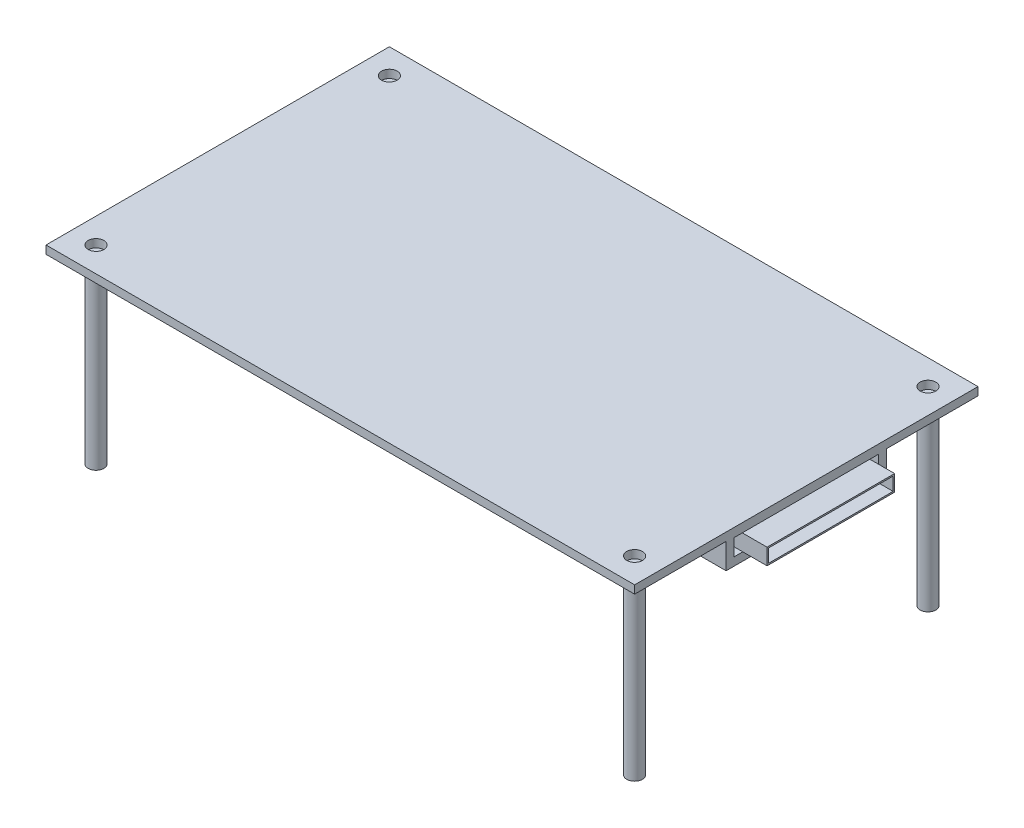
ISO-10303-21;
HEADER;
FILE_DESCRIPTION(('STEP AP214'),'2;1');
FILE_NAME('part.step','',(''),(''),'','','');
FILE_SCHEMA(('AUTOMOTIVE_DESIGN { 1 0 10303 214 1 1 1 1 }'));
ENDSEC;
DATA;
#1=APPLICATION_CONTEXT('core data for automotive mechanical design processes');
#2=APPLICATION_PROTOCOL_DEFINITION('international standard','automotive_design',2000,#1);
#3=PRODUCT_CONTEXT('',#1,'mechanical');
#4=PRODUCT('Part','Part','',(#3));
#5=PRODUCT_RELATED_PRODUCT_CATEGORY('part','',(#4));
#6=PRODUCT_DEFINITION_FORMATION('','',#4);
#7=PRODUCT_DEFINITION_CONTEXT('part definition',#1,'design');
#8=PRODUCT_DEFINITION('design','',#6,#7);
#9=PRODUCT_DEFINITION_SHAPE('','',#8);
#10=(LENGTH_UNIT() NAMED_UNIT(*) SI_UNIT(.MILLI.,.METRE.));
#11=(NAMED_UNIT(*) PLANE_ANGLE_UNIT() SI_UNIT($,.RADIAN.));
#12=(NAMED_UNIT(*) SI_UNIT($,.STERADIAN.) SOLID_ANGLE_UNIT());
#13=UNCERTAINTY_MEASURE_WITH_UNIT(LENGTH_MEASURE(1.E-05),#10,'distance_accuracy_value','');
#14=(GEOMETRIC_REPRESENTATION_CONTEXT(3) GLOBAL_UNCERTAINTY_ASSIGNED_CONTEXT((#13)) GLOBAL_UNIT_ASSIGNED_CONTEXT((#10,
#11,#12)) REPRESENTATION_CONTEXT('',''));
#15=CARTESIAN_POINT('',(0.,0.,0.));
#16=DIRECTION('',(0.,0.,1.));
#17=DIRECTION('',(1.,0.,0.));
#18=AXIS2_PLACEMENT_3D('',#15,#16,#17);
#19=CARTESIAN_POINT('',(-54.9,-35.15,29.9000000000008));
#20=DIRECTION('',(0.,1.,0.));
#21=DIRECTION('',(0.,0.,1.));
#22=AXIS2_PLACEMENT_3D('',#19,#20,#21);
#23=CYLINDRICAL_SURFACE('',#22,1.6);
#24=CARTESIAN_POINT('',(-54.9,-35.15,29.9000000000008));
#25=DIRECTION('',(0.,-1.,0.));
#26=DIRECTION('',(0.,0.,-1.));
#27=AXIS2_PLACEMENT_3D('',#24,#25,#26);
#28=CIRCLE('',#27,1.6);
#29=CARTESIAN_POINT('',(-54.9,-35.15,28.3000000000008));
#30=VERTEX_POINT('',#29);
#31=EDGE_CURVE('E11',#30,#30,#28,.T.);
#32=ORIENTED_EDGE('',*,*,#31,.F.);
#33=EDGE_LOOP('',(#32));
#34=FACE_BOUND('',#33,.T.);
#35=CARTESIAN_POINT('',(-54.9,1.85,29.9000000000008));
#36=DIRECTION('',(0.,-1.,0.));
#37=DIRECTION('',(0.,0.,-1.));
#38=AXIS2_PLACEMENT_3D('',#35,#36,#37);
#39=CIRCLE('',#38,1.6);
#40=CARTESIAN_POINT('',(-54.9,1.85,28.3000000000008));
#41=VERTEX_POINT('',#40);
#42=EDGE_CURVE('E47',#41,#41,#39,.T.);
#43=ORIENTED_EDGE('',*,*,#42,.T.);
#44=EDGE_LOOP('',(#43));
#45=FACE_BOUND('',#44,.T.);
#46=ADVANCED_FACE('F44',(#34,#45),#23,.T.);
#47=CARTESIAN_POINT('',(-54.9,-35.15,29.9000000000008));
#48=DIRECTION('',(0.,-1.,0.));
#49=DIRECTION('',(0.,0.,-1.));
#50=AXIS2_PLACEMENT_3D('',#47,#48,#49);
#51=PLANE('',#50);
#52=ORIENTED_EDGE('',*,*,#31,.T.);
#53=EDGE_LOOP('',(#52));
#54=FACE_BOUND('',#53,.T.);
#55=ADVANCED_FACE('F59',(#54),#51,.T.);
#56=CARTESIAN_POINT('',(-54.9,1.85,29.9000000000008));
#57=DIRECTION('',(0.,-1.,0.));
#58=DIRECTION('',(0.,0.,-1.));
#59=AXIS2_PLACEMENT_3D('',#56,#57,#58);
#60=PLANE('',#59);
#61=ORIENTED_EDGE('',*,*,#42,.F.);
#62=EDGE_LOOP('',(#61));
#63=FACE_BOUND('',#62,.T.);
#64=ADVANCED_FACE('F57',(#63),#60,.F.);
#65=CLOSED_SHELL('',(#46,#55,#64));
#66=MANIFOLD_SOLID_BREP('B2',#65);
#67=CARTESIAN_POINT('',(54.9,-35.15,29.9));
#68=DIRECTION('',(0.,1.,0.));
#69=DIRECTION('',(0.,0.,1.));
#70=AXIS2_PLACEMENT_3D('',#67,#68,#69);
#71=CYLINDRICAL_SURFACE('',#70,1.6);
#72=CARTESIAN_POINT('',(54.9,-35.15,29.9));
#73=DIRECTION('',(0.,-1.,0.));
#74=DIRECTION('',(0.,0.,-1.));
#75=AXIS2_PLACEMENT_3D('',#72,#73,#74);
#76=CIRCLE('',#75,1.6);
#77=CARTESIAN_POINT('',(54.9,-35.15,28.3));
#78=VERTEX_POINT('',#77);
#79=EDGE_CURVE('E43',#78,#78,#76,.T.);
#80=ORIENTED_EDGE('',*,*,#79,.F.);
#81=EDGE_LOOP('',(#80));
#82=FACE_BOUND('',#81,.T.);
#83=CARTESIAN_POINT('',(54.9,1.85,29.9));
#84=DIRECTION('',(0.,-1.,0.));
#85=DIRECTION('',(0.,0.,-1.));
#86=AXIS2_PLACEMENT_3D('',#83,#84,#85);
#87=CIRCLE('',#86,1.6);
#88=CARTESIAN_POINT('',(54.9,1.85,28.3));
#89=VERTEX_POINT('',#88);
#90=EDGE_CURVE('E96',#89,#89,#87,.T.);
#91=ORIENTED_EDGE('',*,*,#90,.T.);
#92=EDGE_LOOP('',(#91));
#93=FACE_BOUND('',#92,.T.);
#94=ADVANCED_FACE('F93',(#82,#93),#71,.T.);
#95=CARTESIAN_POINT('',(54.9,-35.15,29.9));
#96=DIRECTION('',(0.,-1.,0.));
#97=DIRECTION('',(0.,0.,-1.));
#98=AXIS2_PLACEMENT_3D('',#95,#96,#97);
#99=PLANE('',#98);
#100=ORIENTED_EDGE('',*,*,#79,.T.);
#101=EDGE_LOOP('',(#100));
#102=FACE_BOUND('',#101,.T.);
#103=ADVANCED_FACE('F108',(#102),#99,.T.);
#104=CARTESIAN_POINT('',(54.9,1.85,29.9));
#105=DIRECTION('',(0.,-1.,0.));
#106=DIRECTION('',(0.,0.,-1.));
#107=AXIS2_PLACEMENT_3D('',#104,#105,#106);
#108=PLANE('',#107);
#109=ORIENTED_EDGE('',*,*,#90,.F.);
#110=EDGE_LOOP('',(#109));
#111=FACE_BOUND('',#110,.T.);
#112=ADVANCED_FACE('F106',(#111),#108,.F.);
#113=CLOSED_SHELL('',(#94,#103,#112));
#114=MANIFOLD_SOLID_BREP('B6',#113);
#115=CARTESIAN_POINT('',(54.9,-35.15,-29.9));
#116=DIRECTION('',(0.,1.,0.));
#117=DIRECTION('',(0.,0.,1.));
#118=AXIS2_PLACEMENT_3D('',#115,#116,#117);
#119=CYLINDRICAL_SURFACE('',#118,1.6);
#120=CARTESIAN_POINT('',(54.9,-35.15,-29.9));
#121=DIRECTION('',(0.,-1.,0.));
#122=DIRECTION('',(0.,0.,-1.));
#123=AXIS2_PLACEMENT_3D('',#120,#121,#122);
#124=CIRCLE('',#123,1.6);
#125=CARTESIAN_POINT('',(54.9,-35.15,-31.5));
#126=VERTEX_POINT('',#125);
#127=EDGE_CURVE('E92',#126,#126,#124,.T.);
#128=ORIENTED_EDGE('',*,*,#127,.F.);
#129=EDGE_LOOP('',(#128));
#130=FACE_BOUND('',#129,.T.);
#131=CARTESIAN_POINT('',(54.9,1.85000000000001,-29.9));
#132=DIRECTION('',(0.,-1.,0.));
#133=DIRECTION('',(0.,0.,-1.));
#134=AXIS2_PLACEMENT_3D('',#131,#132,#133);
#135=CIRCLE('',#134,1.6);
#136=CARTESIAN_POINT('',(54.9,1.85000000000001,-31.5));
#137=VERTEX_POINT('',#136);
#138=EDGE_CURVE('E145',#137,#137,#135,.T.);
#139=ORIENTED_EDGE('',*,*,#138,.T.);
#140=EDGE_LOOP('',(#139));
#141=FACE_BOUND('',#140,.T.);
#142=ADVANCED_FACE('F142',(#130,#141),#119,.T.);
#143=CARTESIAN_POINT('',(54.9,-35.15,-29.9));
#144=DIRECTION('',(0.,-1.,0.));
#145=DIRECTION('',(0.,0.,-1.));
#146=AXIS2_PLACEMENT_3D('',#143,#144,#145);
#147=PLANE('',#146);
#148=ORIENTED_EDGE('',*,*,#127,.T.);
#149=EDGE_LOOP('',(#148));
#150=FACE_BOUND('',#149,.T.);
#151=ADVANCED_FACE('F157',(#150),#147,.T.);
#152=CARTESIAN_POINT('',(54.9,1.85000000000001,-29.9));
#153=DIRECTION('',(0.,-1.,0.));
#154=DIRECTION('',(0.,0.,-1.));
#155=AXIS2_PLACEMENT_3D('',#152,#153,#154);
#156=PLANE('',#155);
#157=ORIENTED_EDGE('',*,*,#138,.F.);
#158=EDGE_LOOP('',(#157));
#159=FACE_BOUND('',#158,.T.);
#160=ADVANCED_FACE('F155',(#159),#156,.F.);
#161=CLOSED_SHELL('',(#142,#151,#160));
#162=MANIFOLD_SOLID_BREP('B38',#161);
#163=CARTESIAN_POINT('',(-54.9,-35.15,-29.9));
#164=DIRECTION('',(0.,1.,0.));
#165=DIRECTION('',(0.,0.,1.));
#166=AXIS2_PLACEMENT_3D('',#163,#164,#165);
#167=CYLINDRICAL_SURFACE('',#166,1.6);
#168=CARTESIAN_POINT('',(-54.9,-35.15,-29.9));
#169=DIRECTION('',(0.,-1.,0.));
#170=DIRECTION('',(0.,0.,-1.));
#171=AXIS2_PLACEMENT_3D('',#168,#169,#170);
#172=CIRCLE('',#171,1.6);
#173=CARTESIAN_POINT('',(-54.9,-35.15,-31.5));
#174=VERTEX_POINT('',#173);
#175=EDGE_CURVE('E141',#174,#174,#172,.T.);
#176=ORIENTED_EDGE('',*,*,#175,.F.);
#177=EDGE_LOOP('',(#176));
#178=FACE_BOUND('',#177,.T.);
#179=CARTESIAN_POINT('',(-54.9,1.85000000000001,-29.9));
#180=DIRECTION('',(0.,-1.,0.));
#181=DIRECTION('',(0.,0.,-1.));
#182=AXIS2_PLACEMENT_3D('',#179,#180,#181);
#183=CIRCLE('',#182,1.6);
#184=CARTESIAN_POINT('',(-54.9,1.85000000000001,-31.5));
#185=VERTEX_POINT('',#184);
#186=EDGE_CURVE('E196',#185,#185,#183,.T.);
#187=ORIENTED_EDGE('',*,*,#186,.T.);
#188=EDGE_LOOP('',(#187));
#189=FACE_BOUND('',#188,.T.);
#190=ADVANCED_FACE('F193',(#178,#189),#167,.T.);
#191=CARTESIAN_POINT('',(-54.9,-35.15,-29.9));
#192=DIRECTION('',(0.,-1.,0.));
#193=DIRECTION('',(0.,0.,-1.));
#194=AXIS2_PLACEMENT_3D('',#191,#192,#193);
#195=PLANE('',#194);
#196=ORIENTED_EDGE('',*,*,#175,.T.);
#197=EDGE_LOOP('',(#196));
#198=FACE_BOUND('',#197,.T.);
#199=ADVANCED_FACE('F208',(#198),#195,.T.);
#200=CARTESIAN_POINT('',(-54.9,1.85000000000001,-29.9));
#201=DIRECTION('',(0.,-1.,0.));
#202=DIRECTION('',(0.,0.,-1.));
#203=AXIS2_PLACEMENT_3D('',#200,#201,#202);
#204=PLANE('',#203);
#205=ORIENTED_EDGE('',*,*,#186,.F.);
#206=EDGE_LOOP('',(#205));
#207=FACE_BOUND('',#206,.T.);
#208=ADVANCED_FACE('F206',(#207),#204,.F.);
#209=CLOSED_SHELL('',(#190,#199,#208));
#210=MANIFOLD_SOLID_BREP('B87',#209);
#211=CARTESIAN_POINT('',(55.,1.65,-13.));
#212=DIRECTION('',(0.,0.,-1.));
#213=DIRECTION('',(-1.,0.,0.));
#214=AXIS2_PLACEMENT_3D('',#211,#212,#213);
#215=PLANE('',#214);
#216=DIRECTION('',(1.,0.,0.));
#217=VECTOR('',#216,1.);
#218=CARTESIAN_POINT('',(55.,1.65,-13.));
#219=LINE('',#218,#217);
#220=CARTESIAN_POINT('',(55.,1.65,-13.));
#221=VERTEX_POINT('',#220);
#222=CARTESIAN_POINT('',(65.,1.65,-13.));
#223=VERTEX_POINT('',#222);
#224=EDGE_CURVE('E245',#221,#223,#219,.T.);
#225=ORIENTED_EDGE('',*,*,#224,.T.);
#226=DIRECTION('',(0.,1.,0.));
#227=VECTOR('',#226,1.);
#228=CARTESIAN_POINT('',(65.,1.65,-13.));
#229=LINE('',#228,#227);
#230=CARTESIAN_POINT('',(65.,-1.65,-13.));
#231=VERTEX_POINT('',#230);
#232=EDGE_CURVE('E337',#231,#223,#229,.T.);
#233=ORIENTED_EDGE('',*,*,#232,.F.);
#234=DIRECTION('',(1.,0.,0.));
#235=VECTOR('',#234,1.);
#236=CARTESIAN_POINT('',(55.,-1.65,-13.));
#237=LINE('',#236,#235);
#238=CARTESIAN_POINT('',(55.,-1.65,-13.));
#239=VERTEX_POINT('',#238);
#240=EDGE_CURVE('E191',#239,#231,#237,.T.);
#241=ORIENTED_EDGE('',*,*,#240,.F.);
#242=DIRECTION('',(0.,1.,0.));
#243=VECTOR('',#242,1.);
#244=CARTESIAN_POINT('',(55.,1.65,-13.));
#245=LINE('',#244,#243);
#246=EDGE_CURVE('E356',#239,#221,#245,.T.);
#247=ORIENTED_EDGE('',*,*,#246,.T.);
#248=EDGE_LOOP('',(#225,#233,#241,#247));
#249=FACE_BOUND('',#248,.T.);
#250=ADVANCED_FACE('F242',(#249),#215,.T.);
#251=CARTESIAN_POINT('',(55.,-1.65,13.));
#252=DIRECTION('',(0.,-1.,0.));
#253=DIRECTION('',(0.,0.,-1.));
#254=AXIS2_PLACEMENT_3D('',#251,#252,#253);
#255=PLANE('',#254);
#256=ORIENTED_EDGE('',*,*,#240,.T.);
#257=DIRECTION('',(0.,0.,-1.));
#258=VECTOR('',#257,1.);
#259=CARTESIAN_POINT('',(65.,-1.65,13.));
#260=LINE('',#259,#258);
#261=CARTESIAN_POINT('',(65.,-1.65,13.));
#262=VERTEX_POINT('',#261);
#263=EDGE_CURVE('E346',#262,#231,#260,.T.);
#264=ORIENTED_EDGE('',*,*,#263,.F.);
#265=DIRECTION('',(1.,0.,0.));
#266=VECTOR('',#265,1.);
#267=CARTESIAN_POINT('',(55.,-1.65,13.));
#268=LINE('',#267,#266);
#269=CARTESIAN_POINT('',(55.,-1.65,13.));
#270=VERTEX_POINT('',#269);
#271=EDGE_CURVE('E250',#270,#262,#268,.T.);
#272=ORIENTED_EDGE('',*,*,#271,.F.);
#273=DIRECTION('',(0.,0.,-1.));
#274=VECTOR('',#273,1.);
#275=CARTESIAN_POINT('',(55.,-1.65,13.));
#276=LINE('',#275,#274);
#277=EDGE_CURVE('E367',#270,#239,#276,.T.);
#278=ORIENTED_EDGE('',*,*,#277,.T.);
#279=EDGE_LOOP('',(#256,#264,#272,#278));
#280=FACE_BOUND('',#279,.T.);
#281=ADVANCED_FACE('F379',(#280),#255,.T.);
#282=CARTESIAN_POINT('',(55.,1.65,13.));
#283=DIRECTION('',(0.,0.,1.));
#284=DIRECTION('',(1.,0.,0.));
#285=AXIS2_PLACEMENT_3D('',#282,#283,#284);
#286=PLANE('',#285);
#287=ORIENTED_EDGE('',*,*,#271,.T.);
#288=DIRECTION('',(0.,-1.,0.));
#289=VECTOR('',#288,1.);
#290=CARTESIAN_POINT('',(65.,1.65,13.));
#291=LINE('',#290,#289);
#292=CARTESIAN_POINT('',(65.,1.65,13.));
#293=VERTEX_POINT('',#292);
#294=EDGE_CURVE('E343',#293,#262,#291,.T.);
#295=ORIENTED_EDGE('',*,*,#294,.F.);
#296=DIRECTION('',(1.,0.,0.));
#297=VECTOR('',#296,1.);
#298=CARTESIAN_POINT('',(55.,1.65,13.));
#299=LINE('',#298,#297);
#300=CARTESIAN_POINT('',(55.,1.65,13.));
#301=VERTEX_POINT('',#300);
#302=EDGE_CURVE('E370',#301,#293,#299,.T.);
#303=ORIENTED_EDGE('',*,*,#302,.F.);
#304=DIRECTION('',(0.,-1.,0.));
#305=VECTOR('',#304,1.);
#306=CARTESIAN_POINT('',(55.,1.65,13.));
#307=LINE('',#306,#305);
#308=EDGE_CURVE('E364',#301,#270,#307,.T.);
#309=ORIENTED_EDGE('',*,*,#308,.T.);
#310=EDGE_LOOP('',(#287,#295,#303,#309));
#311=FACE_BOUND('',#310,.T.);
#312=ADVANCED_FACE('F385',(#311),#286,.T.);
#313=CARTESIAN_POINT('',(55.,1.65,13.));
#314=DIRECTION('',(0.,1.,0.));
#315=DIRECTION('',(0.,0.,1.));
#316=AXIS2_PLACEMENT_3D('',#313,#314,#315);
#317=PLANE('',#316);
#318=ORIENTED_EDGE('',*,*,#302,.T.);
#319=DIRECTION('',(0.,0.,1.));
#320=VECTOR('',#319,1.);
#321=CARTESIAN_POINT('',(65.,1.65,13.));
#322=LINE('',#321,#320);
#323=EDGE_CURVE('E340',#223,#293,#322,.T.);
#324=ORIENTED_EDGE('',*,*,#323,.F.);
#325=ORIENTED_EDGE('',*,*,#224,.F.);
#326=DIRECTION('',(0.,0.,1.));
#327=VECTOR('',#326,1.);
#328=CARTESIAN_POINT('',(55.,1.65,13.));
#329=LINE('',#328,#327);
#330=EDGE_CURVE('E361',#221,#301,#329,.T.);
#331=ORIENTED_EDGE('',*,*,#330,.T.);
#332=EDGE_LOOP('',(#318,#324,#325,#331));
#333=FACE_BOUND('',#332,.T.);
#334=ADVANCED_FACE('F374',(#333),#317,.T.);
#335=CARTESIAN_POINT('',(55.,0.,0.));
#336=DIRECTION('',(1.,0.,0.));
#337=DIRECTION('',(0.,0.,-1.));
#338=AXIS2_PLACEMENT_3D('',#335,#336,#337);
#339=PLANE('',#338);
#340=DIRECTION('',(0.,0.,-1.));
#341=VECTOR('',#340,1.);
#342=CARTESIAN_POINT('',(55.,-1.35,12.7));
#343=LINE('',#342,#341);
#344=CARTESIAN_POINT('',(55.,-1.35,12.7));
#345=VERTEX_POINT('',#344);
#346=CARTESIAN_POINT('',(55.,-1.35,-12.7));
#347=VERTEX_POINT('',#346);
#348=EDGE_CURVE('E319',#345,#347,#343,.T.);
#349=ORIENTED_EDGE('',*,*,#348,.T.);
#350=DIRECTION('',(0.,1.,0.));
#351=VECTOR('',#350,1.);
#352=CARTESIAN_POINT('',(55.,1.35,-12.7));
#353=LINE('',#352,#351);
#354=CARTESIAN_POINT('',(55.,1.35,-12.7));
#355=VERTEX_POINT('',#354);
#356=EDGE_CURVE('E349',#347,#355,#353,.T.);
#357=ORIENTED_EDGE('',*,*,#356,.T.);
#358=DIRECTION('',(0.,0.,1.));
#359=VECTOR('',#358,1.);
#360=CARTESIAN_POINT('',(55.,1.35,12.7));
#361=LINE('',#360,#359);
#362=CARTESIAN_POINT('',(55.,1.35,12.7));
#363=VERTEX_POINT('',#362);
#364=EDGE_CURVE('E314',#355,#363,#361,.T.);
#365=ORIENTED_EDGE('',*,*,#364,.T.);
#366=DIRECTION('',(0.,-1.,0.));
#367=VECTOR('',#366,1.);
#368=CARTESIAN_POINT('',(55.,1.35,12.7));
#369=LINE('',#368,#367);
#370=EDGE_CURVE('E258',#363,#345,#369,.T.);
#371=ORIENTED_EDGE('',*,*,#370,.T.);
#372=EDGE_LOOP('',(#349,#357,#365,#371));
#373=FACE_BOUND('',#372,.T.);
#374=ORIENTED_EDGE('',*,*,#246,.F.);
#375=ORIENTED_EDGE('',*,*,#277,.F.);
#376=ORIENTED_EDGE('',*,*,#308,.F.);
#377=ORIENTED_EDGE('',*,*,#330,.F.);
#378=EDGE_LOOP('',(#374,#375,#376,#377));
#379=FACE_BOUND('',#378,.T.);
#380=ADVANCED_FACE('F383',(#373,#379),#339,.F.);
#381=CARTESIAN_POINT('',(55.,1.35,-12.7));
#382=DIRECTION('',(0.,0.,-1.));
#383=DIRECTION('',(-1.,0.,0.));
#384=AXIS2_PLACEMENT_3D('',#381,#382,#383);
#385=PLANE('',#384);
#386=DIRECTION('',(1.,0.,0.));
#387=VECTOR('',#386,1.);
#388=CARTESIAN_POINT('',(55.,-1.35,-12.7));
#389=LINE('',#388,#387);
#390=CARTESIAN_POINT('',(65.,-1.35,-12.7));
#391=VERTEX_POINT('',#390);
#392=EDGE_CURVE('E324',#347,#391,#389,.T.);
#393=ORIENTED_EDGE('',*,*,#392,.T.);
#394=DIRECTION('',(0.,1.,0.));
#395=VECTOR('',#394,1.);
#396=CARTESIAN_POINT('',(65.,1.35,-12.7));
#397=LINE('',#396,#395);
#398=CARTESIAN_POINT('',(65.,1.35,-12.7));
#399=VERTEX_POINT('',#398);
#400=EDGE_CURVE('E322',#391,#399,#397,.T.);
#401=ORIENTED_EDGE('',*,*,#400,.T.);
#402=DIRECTION('',(1.,0.,0.));
#403=VECTOR('',#402,1.);
#404=CARTESIAN_POINT('',(55.,1.35,-12.7));
#405=LINE('',#404,#403);
#406=EDGE_CURVE('E307',#355,#399,#405,.T.);
#407=ORIENTED_EDGE('',*,*,#406,.F.);
#408=ORIENTED_EDGE('',*,*,#356,.F.);
#409=EDGE_LOOP('',(#393,#401,#407,#408));
#410=FACE_BOUND('',#409,.T.);
#411=ADVANCED_FACE('F323',(#410),#385,.F.);
#412=CARTESIAN_POINT('',(55.,-1.35,12.7));
#413=DIRECTION('',(0.,-1.,0.));
#414=DIRECTION('',(0.,0.,-1.));
#415=AXIS2_PLACEMENT_3D('',#412,#413,#414);
#416=PLANE('',#415);
#417=DIRECTION('',(1.,0.,0.));
#418=VECTOR('',#417,1.);
#419=CARTESIAN_POINT('',(55.,-1.35,12.7));
#420=LINE('',#419,#418);
#421=CARTESIAN_POINT('',(65.,-1.35,12.7));
#422=VERTEX_POINT('',#421);
#423=EDGE_CURVE('E357',#345,#422,#420,.T.);
#424=ORIENTED_EDGE('',*,*,#423,.T.);
#425=DIRECTION('',(0.,0.,-1.));
#426=VECTOR('',#425,1.);
#427=CARTESIAN_POINT('',(65.,-1.35,12.7));
#428=LINE('',#427,#426);
#429=EDGE_CURVE('E333',#422,#391,#428,.T.);
#430=ORIENTED_EDGE('',*,*,#429,.T.);
#431=ORIENTED_EDGE('',*,*,#392,.F.);
#432=ORIENTED_EDGE('',*,*,#348,.F.);
#433=EDGE_LOOP('',(#424,#430,#431,#432));
#434=FACE_BOUND('',#433,.T.);
#435=ADVANCED_FACE('F428',(#434),#416,.F.);
#436=CARTESIAN_POINT('',(55.,1.35,12.7));
#437=DIRECTION('',(0.,0.,1.));
#438=DIRECTION('',(1.,0.,0.));
#439=AXIS2_PLACEMENT_3D('',#436,#437,#438);
#440=PLANE('',#439);
#441=DIRECTION('',(1.,0.,0.));
#442=VECTOR('',#441,1.);
#443=CARTESIAN_POINT('',(55.,1.35,12.7));
#444=LINE('',#443,#442);
#445=CARTESIAN_POINT('',(65.,1.35,12.7));
#446=VERTEX_POINT('',#445);
#447=EDGE_CURVE('E318',#363,#446,#444,.T.);
#448=ORIENTED_EDGE('',*,*,#447,.T.);
#449=DIRECTION('',(0.,-1.,0.));
#450=VECTOR('',#449,1.);
#451=CARTESIAN_POINT('',(65.,1.35,12.7));
#452=LINE('',#451,#450);
#453=EDGE_CURVE('E331',#446,#422,#452,.T.);
#454=ORIENTED_EDGE('',*,*,#453,.T.);
#455=ORIENTED_EDGE('',*,*,#423,.F.);
#456=ORIENTED_EDGE('',*,*,#370,.F.);
#457=EDGE_LOOP('',(#448,#454,#455,#456));
#458=FACE_BOUND('',#457,.T.);
#459=ADVANCED_FACE('F437',(#458),#440,.F.);
#460=CARTESIAN_POINT('',(55.,1.35,12.7));
#461=DIRECTION('',(0.,1.,0.));
#462=DIRECTION('',(0.,0.,1.));
#463=AXIS2_PLACEMENT_3D('',#460,#461,#462);
#464=PLANE('',#463);
#465=ORIENTED_EDGE('',*,*,#406,.T.);
#466=DIRECTION('',(0.,0.,1.));
#467=VECTOR('',#466,1.);
#468=CARTESIAN_POINT('',(65.,1.35,12.7));
#469=LINE('',#468,#467);
#470=EDGE_CURVE('E311',#399,#446,#469,.T.);
#471=ORIENTED_EDGE('',*,*,#470,.T.);
#472=ORIENTED_EDGE('',*,*,#447,.F.);
#473=ORIENTED_EDGE('',*,*,#364,.F.);
#474=EDGE_LOOP('',(#465,#471,#472,#473));
#475=FACE_BOUND('',#474,.T.);
#476=ADVANCED_FACE('F309',(#475),#464,.F.);
#477=CARTESIAN_POINT('',(65.,0.,0.));
#478=DIRECTION('',(1.,0.,0.));
#479=DIRECTION('',(0.,0.,-1.));
#480=AXIS2_PLACEMENT_3D('',#477,#478,#479);
#481=PLANE('',#480);
#482=ORIENTED_EDGE('',*,*,#232,.T.);
#483=ORIENTED_EDGE('',*,*,#323,.T.);
#484=ORIENTED_EDGE('',*,*,#294,.T.);
#485=ORIENTED_EDGE('',*,*,#263,.T.);
#486=EDGE_LOOP('',(#482,#483,#484,#485));
#487=FACE_BOUND('',#486,.T.);
#488=ORIENTED_EDGE('',*,*,#470,.F.);
#489=ORIENTED_EDGE('',*,*,#400,.F.);
#490=ORIENTED_EDGE('',*,*,#429,.F.);
#491=ORIENTED_EDGE('',*,*,#453,.F.);
#492=EDGE_LOOP('',(#488,#489,#490,#491));
#493=FACE_BOUND('',#492,.T.);
#494=ADVANCED_FACE('F329',(#487,#493),#481,.T.);
#495=CLOSED_SHELL('',(#250,#281,#312,#334,#380,#411,#435,#459,#476,#494));
#496=MANIFOLD_SOLID_BREP('B136',#495);
#497=CARTESIAN_POINT('',(60.,0.,-16.35));
#498=DIRECTION('',(0.,0.,-1.));
#499=DIRECTION('',(0.,1.,0.));
#500=AXIS2_PLACEMENT_3D('',#497,#498,#499);
#501=PLANE('',#500);
#502=DIRECTION('',(0.,-1.,0.));
#503=VECTOR('',#502,1.);
#504=CARTESIAN_POINT('',(-60.,0.,-16.35));
#505=LINE('',#504,#503);
#506=CARTESIAN_POINT('',(-60.,1.85,-16.35));
#507=VERTEX_POINT('',#506);
#508=CARTESIAN_POINT('',(-60.,-3.35,-16.35));
#509=VERTEX_POINT('',#508);
#510=EDGE_CURVE('E635',#507,#509,#505,.T.);
#511=ORIENTED_EDGE('',*,*,#510,.F.);
#512=DIRECTION('',(-1.,0.,0.));
#513=VECTOR('',#512,1.);
#514=CARTESIAN_POINT('',(60.,1.85,-16.35));
#515=LINE('',#514,#513);
#516=CARTESIAN_POINT('',(60.,1.85,-16.35));
#517=VERTEX_POINT('',#516);
#518=EDGE_CURVE('E240',#517,#507,#515,.T.);
#519=ORIENTED_EDGE('',*,*,#518,.F.);
#520=DIRECTION('',(0.,-1.,0.));
#521=VECTOR('',#520,1.);
#522=CARTESIAN_POINT('',(60.,0.,-16.35));
#523=LINE('',#522,#521);
#524=CARTESIAN_POINT('',(60.,-3.35,-16.35));
#525=VERTEX_POINT('',#524);
#526=EDGE_CURVE('E658',#517,#525,#523,.T.);
#527=ORIENTED_EDGE('',*,*,#526,.T.);
#528=DIRECTION('',(-1.,0.,0.));
#529=VECTOR('',#528,1.);
#530=CARTESIAN_POINT('',(60.,-3.35,-16.35));
#531=LINE('',#530,#529);
#532=EDGE_CURVE('E537',#525,#509,#531,.T.);
#533=ORIENTED_EDGE('',*,*,#532,.T.);
#534=EDGE_LOOP('',(#511,#519,#527,#533));
#535=FACE_BOUND('',#534,.T.);
#536=ADVANCED_FACE('F472',(#535),#501,.T.);
#537=CARTESIAN_POINT('',(60.,1.85,0.));
#538=DIRECTION('',(0.,1.,0.));
#539=DIRECTION('',(0.,0.,1.));
#540=AXIS2_PLACEMENT_3D('',#537,#538,#539);
#541=PLANE('',#540);
#542=CARTESIAN_POINT('',(54.9,1.85000000000001,-29.9));
#543=DIRECTION('',(0.,1.,0.));
#544=DIRECTION('',(0.,0.,1.));
#545=AXIS2_PLACEMENT_3D('',#542,#543,#544);
#546=CIRCLE('',#545,1.6);
#547=CARTESIAN_POINT('',(54.9,1.85000000000001,-28.3));
#548=VERTEX_POINT('',#547);
#549=EDGE_CURVE('E673',#548,#548,#546,.F.);
#550=ORIENTED_EDGE('',*,*,#549,.F.);
#551=EDGE_LOOP('',(#550));
#552=FACE_BOUND('',#551,.T.);
#553=CARTESIAN_POINT('',(-54.9,1.85000000000001,-29.9));
#554=DIRECTION('',(0.,1.,0.));
#555=DIRECTION('',(0.,0.,1.));
#556=AXIS2_PLACEMENT_3D('',#553,#554,#555);
#557=CIRCLE('',#556,1.6);
#558=CARTESIAN_POINT('',(-54.9,1.85000000000001,-28.3));
#559=VERTEX_POINT('',#558);
#560=EDGE_CURVE('E647',#559,#559,#557,.F.);
#561=ORIENTED_EDGE('',*,*,#560,.F.);
#562=EDGE_LOOP('',(#561));
#563=FACE_BOUND('',#562,.T.);
#564=DIRECTION('',(0.,0.,-1.));
#565=VECTOR('',#564,1.);
#566=CARTESIAN_POINT('',(-60.,1.85,0.));
#567=LINE('',#566,#565);
#568=CARTESIAN_POINT('',(-60.,1.84999999999999,-35.));
#569=VERTEX_POINT('',#568);
#570=EDGE_CURVE('E632',#507,#569,#567,.T.);
#571=ORIENTED_EDGE('',*,*,#570,.T.);
#572=DIRECTION('',(-1.,0.,0.));
#573=VECTOR('',#572,1.);
#574=CARTESIAN_POINT('',(60.,1.84999999999999,-35.));
#575=LINE('',#574,#573);
#576=CARTESIAN_POINT('',(60.,1.84999999999999,-35.));
#577=VERTEX_POINT('',#576);
#578=EDGE_CURVE('E482',#577,#569,#575,.T.);
#579=ORIENTED_EDGE('',*,*,#578,.F.);
#580=DIRECTION('',(0.,0.,-1.));
#581=VECTOR('',#580,1.);
#582=CARTESIAN_POINT('',(60.,1.85,0.));
#583=LINE('',#582,#581);
#584=EDGE_CURVE('E655',#517,#577,#583,.T.);
#585=ORIENTED_EDGE('',*,*,#584,.F.);
#586=ORIENTED_EDGE('',*,*,#518,.T.);
#587=EDGE_LOOP('',(#571,#579,#585,#586));
#588=FACE_BOUND('',#587,.T.);
#589=ADVANCED_FACE('F711',(#552,#563,#588),#541,.F.);
#590=CARTESIAN_POINT('',(60.,2.94377317135457E-13,-35.));
#591=DIRECTION('',(0.,0.,1.));
#592=DIRECTION('',(0.,-1.,0.));
#593=AXIS2_PLACEMENT_3D('',#590,#591,#592);
#594=PLANE('',#593);
#595=DIRECTION('',(0.,1.,0.));
#596=VECTOR('',#595,1.);
#597=CARTESIAN_POINT('',(-60.,2.94377317135457E-13,-35.));
#598=LINE('',#597,#596);
#599=CARTESIAN_POINT('',(-60.,3.5,-35.));
#600=VERTEX_POINT('',#599);
#601=EDGE_CURVE('E629',#569,#600,#598,.T.);
#602=ORIENTED_EDGE('',*,*,#601,.T.);
#603=DIRECTION('',(-1.,0.,0.));
#604=VECTOR('',#603,1.);
#605=CARTESIAN_POINT('',(60.,3.5,-35.));
#606=LINE('',#605,#604);
#607=CARTESIAN_POINT('',(60.,3.5,-35.));
#608=VERTEX_POINT('',#607);
#609=EDGE_CURVE('E602',#608,#600,#606,.T.);
#610=ORIENTED_EDGE('',*,*,#609,.F.);
#611=DIRECTION('',(0.,1.,0.));
#612=VECTOR('',#611,1.);
#613=CARTESIAN_POINT('',(60.,2.94377317135457E-13,-35.));
#614=LINE('',#613,#612);
#615=EDGE_CURVE('E652',#577,#608,#614,.T.);
#616=ORIENTED_EDGE('',*,*,#615,.F.);
#617=ORIENTED_EDGE('',*,*,#578,.T.);
#618=EDGE_LOOP('',(#602,#610,#616,#617));
#619=FACE_BOUND('',#618,.T.);
#620=ADVANCED_FACE('F697',(#619),#594,.F.);
#621=CARTESIAN_POINT('',(60.,3.5,0.));
#622=DIRECTION('',(0.,-1.,0.));
#623=DIRECTION('',(0.,0.,-1.));
#624=AXIS2_PLACEMENT_3D('',#621,#622,#623);
#625=PLANE('',#624);
#626=CARTESIAN_POINT('',(54.9,3.5,-29.9));
#627=DIRECTION('',(0.,1.,0.));
#628=DIRECTION('',(0.,0.,1.));
#629=AXIS2_PLACEMENT_3D('',#626,#627,#628);
#630=CIRCLE('',#629,1.6);
#631=CARTESIAN_POINT('',(54.9,3.5,-28.3));
#632=VERTEX_POINT('',#631);
#633=EDGE_CURVE('E677',#632,#632,#630,.T.);
#634=ORIENTED_EDGE('',*,*,#633,.F.);
#635=EDGE_LOOP('',(#634));
#636=FACE_BOUND('',#635,.T.);
#637=CARTESIAN_POINT('',(54.9,3.5,29.9));
#638=DIRECTION('',(0.,1.,0.));
#639=DIRECTION('',(0.,0.,1.));
#640=AXIS2_PLACEMENT_3D('',#637,#638,#639);
#641=CIRCLE('',#640,1.6);
#642=CARTESIAN_POINT('',(54.9,3.5,31.5));
#643=VERTEX_POINT('',#642);
#644=EDGE_CURVE('E676',#643,#643,#641,.T.);
#645=ORIENTED_EDGE('',*,*,#644,.F.);
#646=EDGE_LOOP('',(#645));
#647=FACE_BOUND('',#646,.T.);
#648=CARTESIAN_POINT('',(-54.9,3.5,29.9000000000008));
#649=DIRECTION('',(0.,1.,0.));
#650=DIRECTION('',(0.,0.,1.));
#651=AXIS2_PLACEMENT_3D('',#648,#649,#650);
#652=CIRCLE('',#651,1.6);
#653=CARTESIAN_POINT('',(-54.9,3.5,31.5000000000008));
#654=VERTEX_POINT('',#653);
#655=EDGE_CURVE('E683',#654,#654,#652,.T.);
#656=ORIENTED_EDGE('',*,*,#655,.F.);
#657=EDGE_LOOP('',(#656));
#658=FACE_BOUND('',#657,.T.);
#659=CARTESIAN_POINT('',(-54.9,3.5,-29.9));
#660=DIRECTION('',(0.,1.,0.));
#661=DIRECTION('',(0.,0.,1.));
#662=AXIS2_PLACEMENT_3D('',#659,#660,#661);
#663=CIRCLE('',#662,1.6);
#664=CARTESIAN_POINT('',(-54.9,3.5,-28.3));
#665=VERTEX_POINT('',#664);
#666=EDGE_CURVE('E669',#665,#665,#663,.T.);
#667=ORIENTED_EDGE('',*,*,#666,.F.);
#668=EDGE_LOOP('',(#667));
#669=FACE_BOUND('',#668,.T.);
#670=DIRECTION('',(0.,0.,1.));
#671=VECTOR('',#670,1.);
#672=CARTESIAN_POINT('',(-60.,3.5,0.));
#673=LINE('',#672,#671);
#674=CARTESIAN_POINT('',(-60.,3.5,35.));
#675=VERTEX_POINT('',#674);
#676=EDGE_CURVE('E626',#600,#675,#673,.T.);
#677=ORIENTED_EDGE('',*,*,#676,.T.);
#678=DIRECTION('',(-1.,0.,0.));
#679=VECTOR('',#678,1.);
#680=CARTESIAN_POINT('',(60.,3.5,35.));
#681=LINE('',#680,#679);
#682=CARTESIAN_POINT('',(60.,3.5,35.));
#683=VERTEX_POINT('',#682);
#684=EDGE_CURVE('E595',#683,#675,#681,.T.);
#685=ORIENTED_EDGE('',*,*,#684,.F.);
#686=DIRECTION('',(0.,0.,1.));
#687=VECTOR('',#686,1.);
#688=CARTESIAN_POINT('',(60.,3.5,0.));
#689=LINE('',#688,#687);
#690=EDGE_CURVE('E650',#608,#683,#689,.T.);
#691=ORIENTED_EDGE('',*,*,#690,.F.);
#692=ORIENTED_EDGE('',*,*,#609,.T.);
#693=EDGE_LOOP('',(#677,#685,#691,#692));
#694=FACE_BOUND('',#693,.T.);
#695=ADVANCED_FACE('F693',(#636,#647,#658,#669,#694),#625,.F.);
#696=CARTESIAN_POINT('',(60.,0.,35.));
#697=DIRECTION('',(0.,0.,-1.));
#698=DIRECTION('',(-1.,0.,0.));
#699=AXIS2_PLACEMENT_3D('',#696,#697,#698);
#700=PLANE('',#699);
#701=DIRECTION('',(0.,-1.,0.));
#702=VECTOR('',#701,1.);
#703=CARTESIAN_POINT('',(-60.,0.,35.));
#704=LINE('',#703,#702);
#705=CARTESIAN_POINT('',(-60.,1.85,35.));
#706=VERTEX_POINT('',#705);
#707=EDGE_CURVE('E623',#675,#706,#704,.T.);
#708=ORIENTED_EDGE('',*,*,#707,.T.);
#709=DIRECTION('',(-1.,0.,0.));
#710=VECTOR('',#709,1.);
#711=CARTESIAN_POINT('',(60.,1.85,35.));
#712=LINE('',#711,#710);
#713=CARTESIAN_POINT('',(60.,1.85,35.));
#714=VERTEX_POINT('',#713);
#715=EDGE_CURVE('E593',#714,#706,#712,.T.);
#716=ORIENTED_EDGE('',*,*,#715,.F.);
#717=DIRECTION('',(0.,-1.,0.));
#718=VECTOR('',#717,1.);
#719=CARTESIAN_POINT('',(60.,0.,35.));
#720=LINE('',#719,#718);
#721=EDGE_CURVE('E586',#683,#714,#720,.T.);
#722=ORIENTED_EDGE('',*,*,#721,.F.);
#723=ORIENTED_EDGE('',*,*,#684,.T.);
#724=EDGE_LOOP('',(#708,#716,#722,#723));
#725=FACE_BOUND('',#724,.T.);
#726=ADVANCED_FACE('F696',(#725),#700,.F.);
#727=CARTESIAN_POINT('',(60.,1.85,0.));
#728=DIRECTION('',(0.,1.,0.));
#729=DIRECTION('',(0.,0.,1.));
#730=AXIS2_PLACEMENT_3D('',#727,#728,#729);
#731=PLANE('',#730);
#732=CARTESIAN_POINT('',(54.9,1.85,29.9));
#733=DIRECTION('',(0.,1.,0.));
#734=DIRECTION('',(0.,0.,1.));
#735=AXIS2_PLACEMENT_3D('',#732,#733,#734);
#736=CIRCLE('',#735,1.6);
#737=CARTESIAN_POINT('',(54.9,1.85,31.5));
#738=VERTEX_POINT('',#737);
#739=EDGE_CURVE('E680',#738,#738,#736,.F.);
#740=ORIENTED_EDGE('',*,*,#739,.F.);
#741=EDGE_LOOP('',(#740));
#742=FACE_BOUND('',#741,.T.);
#743=CARTESIAN_POINT('',(-54.9,1.85,29.9000000000008));
#744=DIRECTION('',(0.,1.,0.));
#745=DIRECTION('',(0.,0.,1.));
#746=AXIS2_PLACEMENT_3D('',#743,#744,#745);
#747=CIRCLE('',#746,1.6);
#748=CARTESIAN_POINT('',(-54.9,1.85,31.5000000000008));
#749=VERTEX_POINT('',#748);
#750=EDGE_CURVE('E672',#749,#749,#747,.F.);
#751=ORIENTED_EDGE('',*,*,#750,.F.);
#752=EDGE_LOOP('',(#751));
#753=FACE_BOUND('',#752,.T.);
#754=DIRECTION('',(0.,0.,-1.));
#755=VECTOR('',#754,1.);
#756=CARTESIAN_POINT('',(-60.,1.85,0.));
#757=LINE('',#756,#755);
#758=CARTESIAN_POINT('',(-60.,1.85,16.35));
#759=VERTEX_POINT('',#758);
#760=EDGE_CURVE('E592',#706,#759,#757,.T.);
#761=ORIENTED_EDGE('',*,*,#760,.T.);
#762=DIRECTION('',(-1.,0.,0.));
#763=VECTOR('',#762,1.);
#764=CARTESIAN_POINT('',(60.,1.85,16.35));
#765=LINE('',#764,#763);
#766=CARTESIAN_POINT('',(60.,1.85,16.35));
#767=VERTEX_POINT('',#766);
#768=EDGE_CURVE('E578',#767,#759,#765,.T.);
#769=ORIENTED_EDGE('',*,*,#768,.F.);
#770=DIRECTION('',(0.,0.,-1.));
#771=VECTOR('',#770,1.);
#772=CARTESIAN_POINT('',(60.,1.85,0.));
#773=LINE('',#772,#771);
#774=EDGE_CURVE('E581',#714,#767,#773,.T.);
#775=ORIENTED_EDGE('',*,*,#774,.F.);
#776=ORIENTED_EDGE('',*,*,#715,.T.);
#777=EDGE_LOOP('',(#761,#769,#775,#776));
#778=FACE_BOUND('',#777,.T.);
#779=ADVANCED_FACE('F591',(#742,#753,#778),#731,.F.);
#780=CARTESIAN_POINT('',(60.,0.,16.35));
#781=DIRECTION('',(0.,0.,-1.));
#782=DIRECTION('',(-1.,0.,0.));
#783=AXIS2_PLACEMENT_3D('',#780,#781,#782);
#784=PLANE('',#783);
#785=DIRECTION('',(0.,-1.,0.));
#786=VECTOR('',#785,1.);
#787=CARTESIAN_POINT('',(-60.,0.,16.35));
#788=LINE('',#787,#786);
#789=CARTESIAN_POINT('',(-60.,-3.35,16.35));
#790=VERTEX_POINT('',#789);
#791=EDGE_CURVE('E620',#759,#790,#788,.T.);
#792=ORIENTED_EDGE('',*,*,#791,.T.);
#793=DIRECTION('',(-1.,0.,0.));
#794=VECTOR('',#793,1.);
#795=CARTESIAN_POINT('',(60.,-3.35,16.35));
#796=LINE('',#795,#794);
#797=CARTESIAN_POINT('',(60.,-3.35,16.35));
#798=VERTEX_POINT('',#797);
#799=EDGE_CURVE('E580',#798,#790,#796,.T.);
#800=ORIENTED_EDGE('',*,*,#799,.F.);
#801=DIRECTION('',(0.,-1.,0.));
#802=VECTOR('',#801,1.);
#803=CARTESIAN_POINT('',(60.,0.,16.35));
#804=LINE('',#803,#802);
#805=EDGE_CURVE('E573',#767,#798,#804,.T.);
#806=ORIENTED_EDGE('',*,*,#805,.F.);
#807=ORIENTED_EDGE('',*,*,#768,.T.);
#808=EDGE_LOOP('',(#792,#800,#806,#807));
#809=FACE_BOUND('',#808,.T.);
#810=ADVANCED_FACE('F576',(#809),#784,.F.);
#811=CARTESIAN_POINT('',(60.,1.7,0.));
#812=DIRECTION('',(0.,1.,0.));
#813=DIRECTION('',(0.,0.,1.));
#814=AXIS2_PLACEMENT_3D('',#811,#812,#813);
#815=PLANE('',#814);
#816=DIRECTION('',(0.,0.,-1.));
#817=VECTOR('',#816,1.);
#818=CARTESIAN_POINT('',(-60.,1.7,0.));
#819=LINE('',#818,#817);
#820=CARTESIAN_POINT('',(-60.,1.7,14.7));
#821=VERTEX_POINT('',#820);
#822=CARTESIAN_POINT('',(-60.,1.7,-14.7));
#823=VERTEX_POINT('',#822);
#824=EDGE_CURVE('E645',#821,#823,#819,.T.);
#825=ORIENTED_EDGE('',*,*,#824,.T.);
#826=DIRECTION('',(-1.,0.,0.));
#827=VECTOR('',#826,1.);
#828=CARTESIAN_POINT('',(60.,1.7,-14.7));
#829=LINE('',#828,#827);
#830=CARTESIAN_POINT('',(60.,1.7,-14.7));
#831=VERTEX_POINT('',#830);
#832=EDGE_CURVE('E476',#831,#823,#829,.T.);
#833=ORIENTED_EDGE('',*,*,#832,.F.);
#834=DIRECTION('',(0.,0.,-1.));
#835=VECTOR('',#834,1.);
#836=CARTESIAN_POINT('',(60.,1.7,0.));
#837=LINE('',#836,#835);
#838=CARTESIAN_POINT('',(60.,1.7,14.7));
#839=VERTEX_POINT('',#838);
#840=EDGE_CURVE('E619',#839,#831,#837,.T.);
#841=ORIENTED_EDGE('',*,*,#840,.F.);
#842=DIRECTION('',(-1.,0.,0.));
#843=VECTOR('',#842,1.);
#844=CARTESIAN_POINT('',(60.,1.7,14.7));
#845=LINE('',#844,#843);
#846=EDGE_CURVE('E607',#839,#821,#845,.T.);
#847=ORIENTED_EDGE('',*,*,#846,.T.);
#848=EDGE_LOOP('',(#825,#833,#841,#847));
#849=FACE_BOUND('',#848,.T.);
#850=ADVANCED_FACE('F474',(#849),#815,.F.);
#851=CARTESIAN_POINT('',(60.,0.,-14.7));
#852=DIRECTION('',(0.,0.,-1.));
#853=DIRECTION('',(-1.,0.,0.));
#854=AXIS2_PLACEMENT_3D('',#851,#852,#853);
#855=PLANE('',#854);
#856=DIRECTION('',(0.,-1.,0.));
#857=VECTOR('',#856,1.);
#858=CARTESIAN_POINT('',(-60.,0.,-14.7));
#859=LINE('',#858,#857);
#860=CARTESIAN_POINT('',(-60.,-1.7,-14.7));
#861=VERTEX_POINT('',#860);
#862=EDGE_CURVE('E643',#823,#861,#859,.T.);
#863=ORIENTED_EDGE('',*,*,#862,.T.);
#864=DIRECTION('',(-1.,0.,0.));
#865=VECTOR('',#864,1.);
#866=CARTESIAN_POINT('',(60.,-1.7,-14.7));
#867=LINE('',#866,#865);
#868=CARTESIAN_POINT('',(60.,-1.7,-14.7));
#869=VERTEX_POINT('',#868);
#870=EDGE_CURVE('E610',#869,#861,#867,.T.);
#871=ORIENTED_EDGE('',*,*,#870,.F.);
#872=DIRECTION('',(0.,-1.,0.));
#873=VECTOR('',#872,1.);
#874=CARTESIAN_POINT('',(60.,0.,-14.7));
#875=LINE('',#874,#873);
#876=EDGE_CURVE('E545',#831,#869,#875,.T.);
#877=ORIENTED_EDGE('',*,*,#876,.F.);
#878=ORIENTED_EDGE('',*,*,#832,.T.);
#879=EDGE_LOOP('',(#863,#871,#877,#878));
#880=FACE_BOUND('',#879,.T.);
#881=ADVANCED_FACE('F728',(#880),#855,.F.);
#882=CARTESIAN_POINT('',(60.,-1.7,0.));
#883=DIRECTION('',(0.,1.,0.));
#884=DIRECTION('',(0.,0.,1.));
#885=AXIS2_PLACEMENT_3D('',#882,#883,#884);
#886=PLANE('',#885);
#887=DIRECTION('',(0.,0.,-1.));
#888=VECTOR('',#887,1.);
#889=CARTESIAN_POINT('',(-60.,-1.7,0.));
#890=LINE('',#889,#888);
#891=CARTESIAN_POINT('',(-60.,-1.7,14.7));
#892=VERTEX_POINT('',#891);
#893=EDGE_CURVE('E640',#892,#861,#890,.T.);
#894=ORIENTED_EDGE('',*,*,#893,.F.);
#895=DIRECTION('',(-1.,0.,0.));
#896=VECTOR('',#895,1.);
#897=CARTESIAN_POINT('',(60.,-1.7,14.7));
#898=LINE('',#897,#896);
#899=CARTESIAN_POINT('',(60.,-1.7,14.7));
#900=VERTEX_POINT('',#899);
#901=EDGE_CURVE('E609',#900,#892,#898,.T.);
#902=ORIENTED_EDGE('',*,*,#901,.F.);
#903=DIRECTION('',(0.,0.,-1.));
#904=VECTOR('',#903,1.);
#905=CARTESIAN_POINT('',(60.,-1.7,0.));
#906=LINE('',#905,#904);
#907=EDGE_CURVE('E663',#900,#869,#906,.T.);
#908=ORIENTED_EDGE('',*,*,#907,.T.);
#909=ORIENTED_EDGE('',*,*,#870,.T.);
#910=EDGE_LOOP('',(#894,#902,#908,#909));
#911=FACE_BOUND('',#910,.T.);
#912=ADVANCED_FACE('F725',(#911),#886,.T.);
#913=CARTESIAN_POINT('',(60.,0.,14.7));
#914=DIRECTION('',(0.,0.,-1.));
#915=DIRECTION('',(-1.,0.,0.));
#916=AXIS2_PLACEMENT_3D('',#913,#914,#915);
#917=PLANE('',#916);
#918=DIRECTION('',(0.,-1.,0.));
#919=VECTOR('',#918,1.);
#920=CARTESIAN_POINT('',(-60.,0.,14.7));
#921=LINE('',#920,#919);
#922=EDGE_CURVE('E637',#821,#892,#921,.T.);
#923=ORIENTED_EDGE('',*,*,#922,.F.);
#924=ORIENTED_EDGE('',*,*,#846,.F.);
#925=DIRECTION('',(0.,-1.,0.));
#926=VECTOR('',#925,1.);
#927=CARTESIAN_POINT('',(60.,0.,14.7));
#928=LINE('',#927,#926);
#929=EDGE_CURVE('E660',#839,#900,#928,.T.);
#930=ORIENTED_EDGE('',*,*,#929,.T.);
#931=ORIENTED_EDGE('',*,*,#901,.T.);
#932=EDGE_LOOP('',(#923,#924,#930,#931));
#933=FACE_BOUND('',#932,.T.);
#934=ADVANCED_FACE('F721',(#933),#917,.T.);
#935=CARTESIAN_POINT('',(60.,-3.35,0.));
#936=DIRECTION('',(0.,1.,0.));
#937=DIRECTION('',(0.,0.,1.));
#938=AXIS2_PLACEMENT_3D('',#935,#936,#937);
#939=PLANE('',#938);
#940=DIRECTION('',(0.,0.,-1.));
#941=VECTOR('',#940,1.);
#942=CARTESIAN_POINT('',(-60.,-3.35,0.));
#943=LINE('',#942,#941);
#944=EDGE_CURVE('E530',#790,#509,#943,.T.);
#945=ORIENTED_EDGE('',*,*,#944,.T.);
#946=ORIENTED_EDGE('',*,*,#532,.F.);
#947=DIRECTION('',(0.,0.,-1.));
#948=VECTOR('',#947,1.);
#949=CARTESIAN_POINT('',(60.,-3.35,0.));
#950=LINE('',#949,#948);
#951=EDGE_CURVE('E491',#798,#525,#950,.T.);
#952=ORIENTED_EDGE('',*,*,#951,.F.);
#953=ORIENTED_EDGE('',*,*,#799,.T.);
#954=EDGE_LOOP('',(#945,#946,#952,#953));
#955=FACE_BOUND('',#954,.T.);
#956=ADVANCED_FACE('F724',(#955),#939,.F.);
#957=CARTESIAN_POINT('',(60.,0.,0.));
#958=DIRECTION('',(1.,0.,0.));
#959=DIRECTION('',(0.,0.,-1.));
#960=AXIS2_PLACEMENT_3D('',#957,#958,#959);
#961=PLANE('',#960);
#962=ORIENTED_EDGE('',*,*,#840,.T.);
#963=ORIENTED_EDGE('',*,*,#876,.T.);
#964=ORIENTED_EDGE('',*,*,#907,.F.);
#965=ORIENTED_EDGE('',*,*,#929,.F.);
#966=EDGE_LOOP('',(#962,#963,#964,#965));
#967=FACE_BOUND('',#966,.T.);
#968=ORIENTED_EDGE('',*,*,#526,.F.);
#969=ORIENTED_EDGE('',*,*,#584,.T.);
#970=ORIENTED_EDGE('',*,*,#615,.T.);
#971=ORIENTED_EDGE('',*,*,#690,.T.);
#972=ORIENTED_EDGE('',*,*,#721,.T.);
#973=ORIENTED_EDGE('',*,*,#774,.T.);
#974=ORIENTED_EDGE('',*,*,#805,.T.);
#975=ORIENTED_EDGE('',*,*,#951,.T.);
#976=EDGE_LOOP('',(#968,#969,#970,#971,#972,#973,#974,#975));
#977=FACE_BOUND('',#976,.T.);
#978=ADVANCED_FACE('F584',(#967,#977),#961,.T.);
#979=CARTESIAN_POINT('',(-60.,0.,0.));
#980=DIRECTION('',(1.,0.,0.));
#981=DIRECTION('',(0.,0.,-1.));
#982=AXIS2_PLACEMENT_3D('',#979,#980,#981);
#983=PLANE('',#982);
#984=ORIENTED_EDGE('',*,*,#824,.F.);
#985=ORIENTED_EDGE('',*,*,#922,.T.);
#986=ORIENTED_EDGE('',*,*,#893,.T.);
#987=ORIENTED_EDGE('',*,*,#862,.F.);
#988=EDGE_LOOP('',(#984,#985,#986,#987));
#989=FACE_BOUND('',#988,.T.);
#990=ORIENTED_EDGE('',*,*,#510,.T.);
#991=ORIENTED_EDGE('',*,*,#944,.F.);
#992=ORIENTED_EDGE('',*,*,#791,.F.);
#993=ORIENTED_EDGE('',*,*,#760,.F.);
#994=ORIENTED_EDGE('',*,*,#707,.F.);
#995=ORIENTED_EDGE('',*,*,#676,.F.);
#996=ORIENTED_EDGE('',*,*,#601,.F.);
#997=ORIENTED_EDGE('',*,*,#570,.F.);
#998=EDGE_LOOP('',(#990,#991,#992,#993,#994,#995,#996,#997));
#999=FACE_BOUND('',#998,.T.);
#1000=ADVANCED_FACE('F704',(#989,#999),#983,.F.);
#1001=CARTESIAN_POINT('',(-54.9,-2.6754833995939,29.9000000000008));
#1002=DIRECTION('',(0.,1.,0.));
#1003=DIRECTION('',(0.,0.,1.));
#1004=AXIS2_PLACEMENT_3D('',#1001,#1002,#1003);
#1005=CYLINDRICAL_SURFACE('',#1004,1.6);
#1006=ORIENTED_EDGE('',*,*,#750,.T.);
#1007=EDGE_LOOP('',(#1006));
#1008=FACE_BOUND('',#1007,.T.);
#1009=ORIENTED_EDGE('',*,*,#655,.T.);
#1010=EDGE_LOOP('',(#1009));
#1011=FACE_BOUND('',#1010,.T.);
#1012=ADVANCED_FACE('F691',(#1008,#1011),#1005,.F.);
#1013=CARTESIAN_POINT('',(54.9,-2.6754833995939,29.9));
#1014=DIRECTION('',(0.,1.,0.));
#1015=DIRECTION('',(0.,0.,1.));
#1016=AXIS2_PLACEMENT_3D('',#1013,#1014,#1015);
#1017=CYLINDRICAL_SURFACE('',#1016,1.6);
#1018=ORIENTED_EDGE('',*,*,#739,.T.);
#1019=EDGE_LOOP('',(#1018));
#1020=FACE_BOUND('',#1019,.T.);
#1021=ORIENTED_EDGE('',*,*,#644,.T.);
#1022=EDGE_LOOP('',(#1021));
#1023=FACE_BOUND('',#1022,.T.);
#1024=ADVANCED_FACE('F846',(#1020,#1023),#1017,.F.);
#1025=CARTESIAN_POINT('',(-54.9,-2.6754833995939,-29.9));
#1026=DIRECTION('',(0.,1.,0.));
#1027=DIRECTION('',(0.,0.,1.));
#1028=AXIS2_PLACEMENT_3D('',#1025,#1026,#1027);
#1029=CYLINDRICAL_SURFACE('',#1028,1.6);
#1030=ORIENTED_EDGE('',*,*,#560,.T.);
#1031=EDGE_LOOP('',(#1030));
#1032=FACE_BOUND('',#1031,.T.);
#1033=ORIENTED_EDGE('',*,*,#666,.T.);
#1034=EDGE_LOOP('',(#1033));
#1035=FACE_BOUND('',#1034,.T.);
#1036=ADVANCED_FACE('F751',(#1032,#1035),#1029,.F.);
#1037=CARTESIAN_POINT('',(54.9,-2.6754833995939,-29.9));
#1038=DIRECTION('',(0.,1.,0.));
#1039=DIRECTION('',(0.,0.,1.));
#1040=AXIS2_PLACEMENT_3D('',#1037,#1038,#1039);
#1041=CYLINDRICAL_SURFACE('',#1040,1.6);
#1042=ORIENTED_EDGE('',*,*,#549,.T.);
#1043=EDGE_LOOP('',(#1042));
#1044=FACE_BOUND('',#1043,.T.);
#1045=ORIENTED_EDGE('',*,*,#633,.T.);
#1046=EDGE_LOOP('',(#1045));
#1047=FACE_BOUND('',#1046,.T.);
#1048=ADVANCED_FACE('F860',(#1044,#1047),#1041,.F.);
#1049=CLOSED_SHELL('',(#536,#589,#620,#695,#726,#779,#810,#850,#881,#912,#934,#956,#978,#1000,
#1012,#1024,#1036,#1048));
#1050=MANIFOLD_SOLID_BREP('B185',#1049);
#1051=ADVANCED_BREP_SHAPE_REPRESENTATION('',(#18,#66,#114,#162,#210,#496,#1050),#14);
#1052=SHAPE_DEFINITION_REPRESENTATION(#9,#1051);
ENDSEC;
END-ISO-10303-21;
